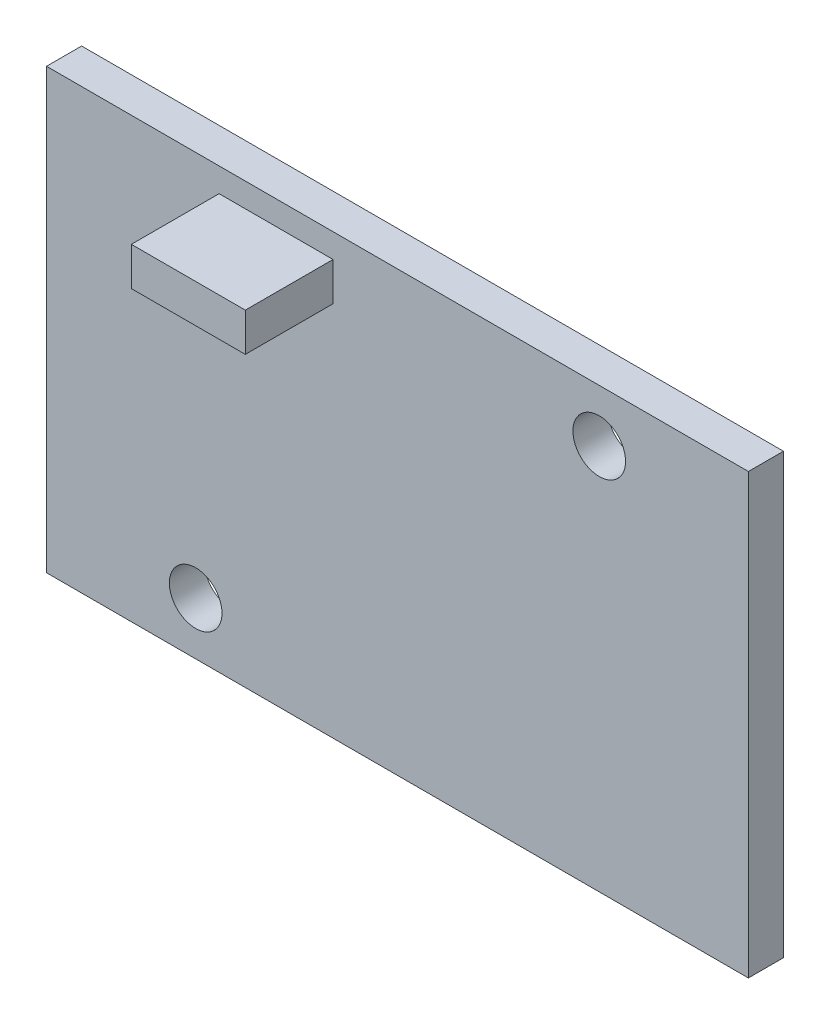
ISO-10303-21;
HEADER;
FILE_DESCRIPTION(('STEP AP214'),'2;1');
FILE_NAME('part.step','',(''),(''),'','','');
FILE_SCHEMA(('AUTOMOTIVE_DESIGN { 1 0 10303 214 1 1 1 1 }'));
ENDSEC;
DATA;
#1=APPLICATION_CONTEXT('core data for automotive mechanical design processes');
#2=APPLICATION_PROTOCOL_DEFINITION('international standard','automotive_design',2000,#1);
#3=PRODUCT_CONTEXT('',#1,'mechanical');
#4=PRODUCT('Part','Part','',(#3));
#5=PRODUCT_RELATED_PRODUCT_CATEGORY('part','',(#4));
#6=PRODUCT_DEFINITION_FORMATION('','',#4);
#7=PRODUCT_DEFINITION_CONTEXT('part definition',#1,'design');
#8=PRODUCT_DEFINITION('design','',#6,#7);
#9=PRODUCT_DEFINITION_SHAPE('','',#8);
#10=(LENGTH_UNIT() NAMED_UNIT(*) SI_UNIT(.MILLI.,.METRE.));
#11=(NAMED_UNIT(*) PLANE_ANGLE_UNIT() SI_UNIT($,.RADIAN.));
#12=(NAMED_UNIT(*) SI_UNIT($,.STERADIAN.) SOLID_ANGLE_UNIT());
#13=UNCERTAINTY_MEASURE_WITH_UNIT(LENGTH_MEASURE(1.E-05),#10,'distance_accuracy_value','');
#14=(GEOMETRIC_REPRESENTATION_CONTEXT(3) GLOBAL_UNCERTAINTY_ASSIGNED_CONTEXT((#13)) GLOBAL_UNIT_ASSIGNED_CONTEXT((#10,
#11,#12)) REPRESENTATION_CONTEXT('',''));
#15=CARTESIAN_POINT('',(0.,0.,0.));
#16=DIRECTION('',(0.,0.,1.));
#17=DIRECTION('',(1.,0.,0.));
#18=AXIS2_PLACEMENT_3D('',#15,#16,#17);
#19=CARTESIAN_POINT('',(0.,0.,2.));
#20=DIRECTION('',(0.,0.,1.));
#21=DIRECTION('',(1.,0.,0.));
#22=AXIS2_PLACEMENT_3D('',#19,#20,#21);
#23=PLANE('',#22);
#24=CARTESIAN_POINT('',(3.748160672956,17.0574712643678,2.));
#25=DIRECTION('',(0.,0.,1.));
#26=DIRECTION('',(1.,0.,0.));
#27=AXIS2_PLACEMENT_3D('',#24,#25,#26);
#28=CIRCLE('',#27,1.5);
#29=CARTESIAN_POINT('',(5.248160672956,17.0574712643678,2.));
#30=VERTEX_POINT('',#29);
#31=EDGE_CURVE('E146',#30,#30,#28,.T.);
#32=ORIENTED_EDGE('',*,*,#31,.F.);
#33=EDGE_LOOP('',(#32));
#34=FACE_BOUND('',#33,.T.);
#35=DIRECTION('',(0.,-1.,0.));
#36=VECTOR('',#35,1.);
#37=CARTESIAN_POINT('',(-27.751839327044,20.0574712643678,2.));
#38=LINE('',#37,#36);
#39=CARTESIAN_POINT('',(-27.751839327044,20.0574712643678,2.));
#40=VERTEX_POINT('',#39);
#41=CARTESIAN_POINT('',(-27.751839327044,-4.94252873563219,2.));
#42=VERTEX_POINT('',#41);
#43=EDGE_CURVE('E152',#40,#42,#38,.T.);
#44=ORIENTED_EDGE('',*,*,#43,.T.);
#45=DIRECTION('',(1.,0.,0.));
#46=VECTOR('',#45,1.);
#47=CARTESIAN_POINT('',(-27.751839327044,-4.94252873563219,2.));
#48=LINE('',#47,#46);
#49=CARTESIAN_POINT('',(12.248160672956,-4.94252873563219,2.));
#50=VERTEX_POINT('',#49);
#51=EDGE_CURVE('E88',#42,#50,#48,.T.);
#52=ORIENTED_EDGE('',*,*,#51,.T.);
#53=DIRECTION('',(0.,1.,0.));
#54=VECTOR('',#53,1.);
#55=CARTESIAN_POINT('',(12.248160672956,20.0574712643678,2.));
#56=LINE('',#55,#54);
#57=CARTESIAN_POINT('',(12.248160672956,20.0574712643678,2.));
#58=VERTEX_POINT('',#57);
#59=EDGE_CURVE('E155',#50,#58,#56,.T.);
#60=ORIENTED_EDGE('',*,*,#59,.T.);
#61=DIRECTION('',(-1.,0.,0.));
#62=VECTOR('',#61,1.);
#63=CARTESIAN_POINT('',(-27.751839327044,20.0574712643678,2.));
#64=LINE('',#63,#62);
#65=EDGE_CURVE('E60',#58,#40,#64,.T.);
#66=ORIENTED_EDGE('',*,*,#65,.T.);
#67=EDGE_LOOP('',(#44,#52,#60,#66));
#68=FACE_BOUND('',#67,.T.);
#69=CARTESIAN_POINT('',(-19.251839327044,-1.94252873563218,2.));
#70=DIRECTION('',(0.,0.,1.));
#71=DIRECTION('',(1.,0.,0.));
#72=AXIS2_PLACEMENT_3D('',#69,#70,#71);
#73=CIRCLE('',#72,1.5);
#74=CARTESIAN_POINT('',(-17.751839327044,-1.94252873563218,2.));
#75=VERTEX_POINT('',#74);
#76=EDGE_CURVE('E138',#75,#75,#73,.T.);
#77=ORIENTED_EDGE('',*,*,#76,.F.);
#78=EDGE_LOOP('',(#77));
#79=FACE_BOUND('',#78,.T.);
#80=DIRECTION('',(1.,0.,0.));
#81=VECTOR('',#80,1.);
#82=CARTESIAN_POINT('',(-17.9170500102579,16.5013554682076,2.));
#83=LINE('',#82,#81);
#84=CARTESIAN_POINT('',(-17.9170500102579,16.5013554682076,2.));
#85=VERTEX_POINT('',#84);
#86=CARTESIAN_POINT('',(-11.4227704662078,16.5013554682076,2.));
#87=VERTEX_POINT('',#86);
#88=EDGE_CURVE('E301',#85,#87,#83,.T.);
#89=ORIENTED_EDGE('',*,*,#88,.F.);
#90=DIRECTION('',(0.,-1.,0.));
#91=VECTOR('',#90,1.);
#92=CARTESIAN_POINT('',(-17.9170500102579,18.6864008858123,2.));
#93=LINE('',#92,#91);
#94=CARTESIAN_POINT('',(-17.9170500102579,18.6864008858123,2.));
#95=VERTEX_POINT('',#94);
#96=EDGE_CURVE('E133',#95,#85,#93,.T.);
#97=ORIENTED_EDGE('',*,*,#96,.F.);
#98=DIRECTION('',(-1.,0.,0.));
#99=VECTOR('',#98,1.);
#100=CARTESIAN_POINT('',(-17.9170500102579,18.6864008858123,2.));
#101=LINE('',#100,#99);
#102=CARTESIAN_POINT('',(-11.4227704662078,18.6864008858123,2.));
#103=VERTEX_POINT('',#102);
#104=EDGE_CURVE('E129',#103,#95,#101,.T.);
#105=ORIENTED_EDGE('',*,*,#104,.F.);
#106=DIRECTION('',(0.,1.,0.));
#107=VECTOR('',#106,1.);
#108=CARTESIAN_POINT('',(-11.4227704662078,18.6864008858123,2.));
#109=LINE('',#108,#107);
#110=EDGE_CURVE('E298',#87,#103,#109,.T.);
#111=ORIENTED_EDGE('',*,*,#110,.F.);
#112=EDGE_LOOP('',(#89,#97,#105,#111));
#113=FACE_BOUND('',#112,.T.);
#114=ADVANCED_FACE('F36',(#34,#68,#79,#113),#23,.T.);
#115=CARTESIAN_POINT('',(0.,0.,0.));
#116=DIRECTION('',(0.,0.,1.));
#117=DIRECTION('',(1.,0.,0.));
#118=AXIS2_PLACEMENT_3D('',#115,#116,#117);
#119=PLANE('',#118);
#120=DIRECTION('',(0.,-1.,0.));
#121=VECTOR('',#120,1.);
#122=CARTESIAN_POINT('',(-27.751839327044,20.0574712643678,0.));
#123=LINE('',#122,#121);
#124=CARTESIAN_POINT('',(-27.751839327044,20.0574712643678,0.));
#125=VERTEX_POINT('',#124);
#126=CARTESIAN_POINT('',(-27.751839327044,-4.94252873563219,0.));
#127=VERTEX_POINT('',#126);
#128=EDGE_CURVE('E149',#125,#127,#123,.T.);
#129=ORIENTED_EDGE('',*,*,#128,.F.);
#130=DIRECTION('',(-1.,0.,0.));
#131=VECTOR('',#130,1.);
#132=CARTESIAN_POINT('',(-27.751839327044,20.0574712643678,0.));
#133=LINE('',#132,#131);
#134=CARTESIAN_POINT('',(12.248160672956,20.0574712643678,0.));
#135=VERTEX_POINT('',#134);
#136=EDGE_CURVE('E81',#135,#125,#133,.T.);
#137=ORIENTED_EDGE('',*,*,#136,.F.);
#138=DIRECTION('',(0.,1.,0.));
#139=VECTOR('',#138,1.);
#140=CARTESIAN_POINT('',(12.248160672956,20.0574712643678,0.));
#141=LINE('',#140,#139);
#142=CARTESIAN_POINT('',(12.248160672956,-4.94252873563219,0.));
#143=VERTEX_POINT('',#142);
#144=EDGE_CURVE('E163',#143,#135,#141,.T.);
#145=ORIENTED_EDGE('',*,*,#144,.F.);
#146=DIRECTION('',(1.,0.,0.));
#147=VECTOR('',#146,1.);
#148=CARTESIAN_POINT('',(-27.751839327044,-4.94252873563219,0.));
#149=LINE('',#148,#147);
#150=EDGE_CURVE('E161',#127,#143,#149,.T.);
#151=ORIENTED_EDGE('',*,*,#150,.F.);
#152=EDGE_LOOP('',(#129,#137,#145,#151));
#153=FACE_BOUND('',#152,.T.);
#154=CARTESIAN_POINT('',(3.748160672956,17.0574712643678,0.));
#155=DIRECTION('',(0.,0.,1.));
#156=DIRECTION('',(1.,0.,0.));
#157=AXIS2_PLACEMENT_3D('',#154,#155,#156);
#158=CIRCLE('',#157,1.5);
#159=CARTESIAN_POINT('',(5.248160672956,17.0574712643678,0.));
#160=VERTEX_POINT('',#159);
#161=EDGE_CURVE('E144',#160,#160,#158,.T.);
#162=ORIENTED_EDGE('',*,*,#161,.T.);
#163=EDGE_LOOP('',(#162));
#164=FACE_BOUND('',#163,.T.);
#165=CARTESIAN_POINT('',(-19.251839327044,-1.94252873563218,0.));
#166=DIRECTION('',(0.,0.,1.));
#167=DIRECTION('',(1.,0.,0.));
#168=AXIS2_PLACEMENT_3D('',#165,#166,#167);
#169=CIRCLE('',#168,1.5);
#170=CARTESIAN_POINT('',(-17.751839327044,-1.94252873563218,0.));
#171=VERTEX_POINT('',#170);
#172=EDGE_CURVE('E135',#171,#171,#169,.T.);
#173=ORIENTED_EDGE('',*,*,#172,.T.);
#174=EDGE_LOOP('',(#173));
#175=FACE_BOUND('',#174,.T.);
#176=ADVANCED_FACE('F176',(#153,#164,#175),#119,.F.);
#177=CARTESIAN_POINT('',(-27.751839327044,20.0574712643678,2.));
#178=DIRECTION('',(1.,0.,0.));
#179=DIRECTION('',(0.,0.,-1.));
#180=AXIS2_PLACEMENT_3D('',#177,#178,#179);
#181=PLANE('',#180);
#182=ORIENTED_EDGE('',*,*,#128,.T.);
#183=DIRECTION('',(0.,0.,-1.));
#184=VECTOR('',#183,1.);
#185=CARTESIAN_POINT('',(-27.751839327044,-4.94252873563219,2.));
#186=LINE('',#185,#184);
#187=EDGE_CURVE('E11',#42,#127,#186,.T.);
#188=ORIENTED_EDGE('',*,*,#187,.F.);
#189=ORIENTED_EDGE('',*,*,#43,.F.);
#190=DIRECTION('',(0.,0.,-1.));
#191=VECTOR('',#190,1.);
#192=CARTESIAN_POINT('',(-27.751839327044,20.0574712643678,2.));
#193=LINE('',#192,#191);
#194=EDGE_CURVE('E158',#40,#125,#193,.T.);
#195=ORIENTED_EDGE('',*,*,#194,.T.);
#196=EDGE_LOOP('',(#182,#188,#189,#195));
#197=FACE_BOUND('',#196,.T.);
#198=ADVANCED_FACE('F38',(#197),#181,.F.);
#199=CARTESIAN_POINT('',(-27.751839327044,-4.94252873563219,2.));
#200=DIRECTION('',(0.,1.,0.));
#201=DIRECTION('',(0.,0.,1.));
#202=AXIS2_PLACEMENT_3D('',#199,#200,#201);
#203=PLANE('',#202);
#204=ORIENTED_EDGE('',*,*,#150,.T.);
#205=DIRECTION('',(0.,0.,-1.));
#206=VECTOR('',#205,1.);
#207=CARTESIAN_POINT('',(12.248160672956,-4.94252873563219,2.));
#208=LINE('',#207,#206);
#209=EDGE_CURVE('E44',#50,#143,#208,.T.);
#210=ORIENTED_EDGE('',*,*,#209,.F.);
#211=ORIENTED_EDGE('',*,*,#51,.F.);
#212=ORIENTED_EDGE('',*,*,#187,.T.);
#213=EDGE_LOOP('',(#204,#210,#211,#212));
#214=FACE_BOUND('',#213,.T.);
#215=ADVANCED_FACE('F192',(#214),#203,.F.);
#216=CARTESIAN_POINT('',(12.248160672956,20.0574712643678,2.));
#217=DIRECTION('',(-1.,0.,0.));
#218=DIRECTION('',(0.,0.,1.));
#219=AXIS2_PLACEMENT_3D('',#216,#217,#218);
#220=PLANE('',#219);
#221=ORIENTED_EDGE('',*,*,#144,.T.);
#222=DIRECTION('',(0.,0.,-1.));
#223=VECTOR('',#222,1.);
#224=CARTESIAN_POINT('',(12.248160672956,20.0574712643678,2.));
#225=LINE('',#224,#223);
#226=EDGE_CURVE('E167',#58,#135,#225,.T.);
#227=ORIENTED_EDGE('',*,*,#226,.F.);
#228=ORIENTED_EDGE('',*,*,#59,.F.);
#229=ORIENTED_EDGE('',*,*,#209,.T.);
#230=EDGE_LOOP('',(#221,#227,#228,#229));
#231=FACE_BOUND('',#230,.T.);
#232=ADVANCED_FACE('F172',(#231),#220,.F.);
#233=CARTESIAN_POINT('',(-27.751839327044,20.0574712643678,2.));
#234=DIRECTION('',(0.,-1.,0.));
#235=DIRECTION('',(0.,0.,-1.));
#236=AXIS2_PLACEMENT_3D('',#233,#234,#235);
#237=PLANE('',#236);
#238=ORIENTED_EDGE('',*,*,#136,.T.);
#239=ORIENTED_EDGE('',*,*,#194,.F.);
#240=ORIENTED_EDGE('',*,*,#65,.F.);
#241=ORIENTED_EDGE('',*,*,#226,.T.);
#242=EDGE_LOOP('',(#238,#239,#240,#241));
#243=FACE_BOUND('',#242,.T.);
#244=ADVANCED_FACE('F181',(#243),#237,.F.);
#245=CARTESIAN_POINT('',(3.748160672956,17.0574712643678,2.));
#246=DIRECTION('',(0.,0.,-1.));
#247=DIRECTION('',(-1.,0.,0.));
#248=AXIS2_PLACEMENT_3D('',#245,#246,#247);
#249=CYLINDRICAL_SURFACE('',#248,1.5);
#250=ORIENTED_EDGE('',*,*,#31,.T.);
#251=EDGE_LOOP('',(#250));
#252=FACE_BOUND('',#251,.T.);
#253=ORIENTED_EDGE('',*,*,#161,.F.);
#254=EDGE_LOOP('',(#253));
#255=FACE_BOUND('',#254,.T.);
#256=ADVANCED_FACE('F183',(#252,#255),#249,.F.);
#257=CARTESIAN_POINT('',(-19.251839327044,-1.94252873563218,2.));
#258=DIRECTION('',(0.,0.,-1.));
#259=DIRECTION('',(-1.,0.,0.));
#260=AXIS2_PLACEMENT_3D('',#257,#258,#259);
#261=CYLINDRICAL_SURFACE('',#260,1.5);
#262=ORIENTED_EDGE('',*,*,#76,.T.);
#263=EDGE_LOOP('',(#262));
#264=FACE_BOUND('',#263,.T.);
#265=ORIENTED_EDGE('',*,*,#172,.F.);
#266=EDGE_LOOP('',(#265));
#267=FACE_BOUND('',#266,.T.);
#268=ADVANCED_FACE('F189',(#264,#267),#261,.F.);
#269=CARTESIAN_POINT('',(-17.9170500102579,18.6864008858123,7.));
#270=DIRECTION('',(1.,0.,0.));
#271=DIRECTION('',(0.,0.,-1.));
#272=AXIS2_PLACEMENT_3D('',#269,#270,#271);
#273=PLANE('',#272);
#274=ORIENTED_EDGE('',*,*,#96,.T.);
#275=DIRECTION('',(0.,0.,-1.));
#276=VECTOR('',#275,1.);
#277=CARTESIAN_POINT('',(-17.9170500102579,16.5013554682076,7.));
#278=LINE('',#277,#276);
#279=CARTESIAN_POINT('',(-17.9170500102579,16.5013554682076,7.));
#280=VERTEX_POINT('',#279);
#281=EDGE_CURVE('E114',#280,#85,#278,.T.);
#282=ORIENTED_EDGE('',*,*,#281,.F.);
#283=DIRECTION('',(0.,-1.,0.));
#284=VECTOR('',#283,1.);
#285=CARTESIAN_POINT('',(-17.9170500102579,18.6864008858123,7.));
#286=LINE('',#285,#284);
#287=CARTESIAN_POINT('',(-17.9170500102579,18.6864008858123,7.));
#288=VERTEX_POINT('',#287);
#289=EDGE_CURVE('E121',#288,#280,#286,.T.);
#290=ORIENTED_EDGE('',*,*,#289,.F.);
#291=DIRECTION('',(0.,0.,-1.));
#292=VECTOR('',#291,1.);
#293=CARTESIAN_POINT('',(-17.9170500102579,18.6864008858123,7.));
#294=LINE('',#293,#292);
#295=EDGE_CURVE('E295',#288,#95,#294,.T.);
#296=ORIENTED_EDGE('',*,*,#295,.T.);
#297=EDGE_LOOP('',(#274,#282,#290,#296));
#298=FACE_BOUND('',#297,.T.);
#299=ADVANCED_FACE('F131',(#298),#273,.F.);
#300=CARTESIAN_POINT('',(-17.9170500102579,16.5013554682076,7.));
#301=DIRECTION('',(0.,1.,0.));
#302=DIRECTION('',(0.,0.,1.));
#303=AXIS2_PLACEMENT_3D('',#300,#301,#302);
#304=PLANE('',#303);
#305=ORIENTED_EDGE('',*,*,#88,.T.);
#306=DIRECTION('',(0.,0.,-1.));
#307=VECTOR('',#306,1.);
#308=CARTESIAN_POINT('',(-11.4227704662078,16.5013554682076,7.));
#309=LINE('',#308,#307);
#310=CARTESIAN_POINT('',(-11.4227704662078,16.5013554682076,7.));
#311=VERTEX_POINT('',#310);
#312=EDGE_CURVE('E117',#311,#87,#309,.T.);
#313=ORIENTED_EDGE('',*,*,#312,.F.);
#314=DIRECTION('',(1.,0.,0.));
#315=VECTOR('',#314,1.);
#316=CARTESIAN_POINT('',(-17.9170500102579,16.5013554682076,7.));
#317=LINE('',#316,#315);
#318=EDGE_CURVE('E110',#280,#311,#317,.T.);
#319=ORIENTED_EDGE('',*,*,#318,.F.);
#320=ORIENTED_EDGE('',*,*,#281,.T.);
#321=EDGE_LOOP('',(#305,#313,#319,#320));
#322=FACE_BOUND('',#321,.T.);
#323=ADVANCED_FACE('F112',(#322),#304,.F.);
#324=CARTESIAN_POINT('',(-11.4227704662078,18.6864008858123,7.));
#325=DIRECTION('',(-1.,0.,0.));
#326=DIRECTION('',(0.,0.,1.));
#327=AXIS2_PLACEMENT_3D('',#324,#325,#326);
#328=PLANE('',#327);
#329=ORIENTED_EDGE('',*,*,#110,.T.);
#330=DIRECTION('',(0.,0.,-1.));
#331=VECTOR('',#330,1.);
#332=CARTESIAN_POINT('',(-11.4227704662078,18.6864008858123,7.));
#333=LINE('',#332,#331);
#334=CARTESIAN_POINT('',(-11.4227704662078,18.6864008858123,7.));
#335=VERTEX_POINT('',#334);
#336=EDGE_CURVE('E51',#335,#103,#333,.T.);
#337=ORIENTED_EDGE('',*,*,#336,.F.);
#338=DIRECTION('',(0.,1.,0.));
#339=VECTOR('',#338,1.);
#340=CARTESIAN_POINT('',(-11.4227704662078,18.6864008858123,7.));
#341=LINE('',#340,#339);
#342=EDGE_CURVE('E120',#311,#335,#341,.T.);
#343=ORIENTED_EDGE('',*,*,#342,.F.);
#344=ORIENTED_EDGE('',*,*,#312,.T.);
#345=EDGE_LOOP('',(#329,#337,#343,#344));
#346=FACE_BOUND('',#345,.T.);
#347=ADVANCED_FACE('F212',(#346),#328,.F.);
#348=CARTESIAN_POINT('',(-17.9170500102579,18.6864008858123,7.));
#349=DIRECTION('',(0.,-1.,0.));
#350=DIRECTION('',(0.,0.,-1.));
#351=AXIS2_PLACEMENT_3D('',#348,#349,#350);
#352=PLANE('',#351);
#353=ORIENTED_EDGE('',*,*,#104,.T.);
#354=ORIENTED_EDGE('',*,*,#295,.F.);
#355=DIRECTION('',(-1.,0.,0.));
#356=VECTOR('',#355,1.);
#357=CARTESIAN_POINT('',(-17.9170500102579,18.6864008858123,7.));
#358=LINE('',#357,#356);
#359=EDGE_CURVE('E125',#335,#288,#358,.T.);
#360=ORIENTED_EDGE('',*,*,#359,.F.);
#361=ORIENTED_EDGE('',*,*,#336,.T.);
#362=EDGE_LOOP('',(#353,#354,#360,#361));
#363=FACE_BOUND('',#362,.T.);
#364=ADVANCED_FACE('F215',(#363),#352,.F.);
#365=CARTESIAN_POINT('',(0.,0.,7.));
#366=DIRECTION('',(0.,0.,1.));
#367=DIRECTION('',(1.,0.,0.));
#368=AXIS2_PLACEMENT_3D('',#365,#366,#367);
#369=PLANE('',#368);
#370=ORIENTED_EDGE('',*,*,#289,.T.);
#371=ORIENTED_EDGE('',*,*,#318,.T.);
#372=ORIENTED_EDGE('',*,*,#342,.T.);
#373=ORIENTED_EDGE('',*,*,#359,.T.);
#374=EDGE_LOOP('',(#370,#371,#372,#373));
#375=FACE_BOUND('',#374,.T.);
#376=ADVANCED_FACE('F124',(#375),#369,.T.);
#377=CLOSED_SHELL('',(#114,#176,#198,#215,#232,#244,#256,#268,#299,#323,#347,#364,#376));
#378=MANIFOLD_SOLID_BREP('B2',#377);
#379=ADVANCED_BREP_SHAPE_REPRESENTATION('',(#18,#378),#14);
#380=SHAPE_DEFINITION_REPRESENTATION(#9,#379);
ENDSEC;
END-ISO-10303-21;
